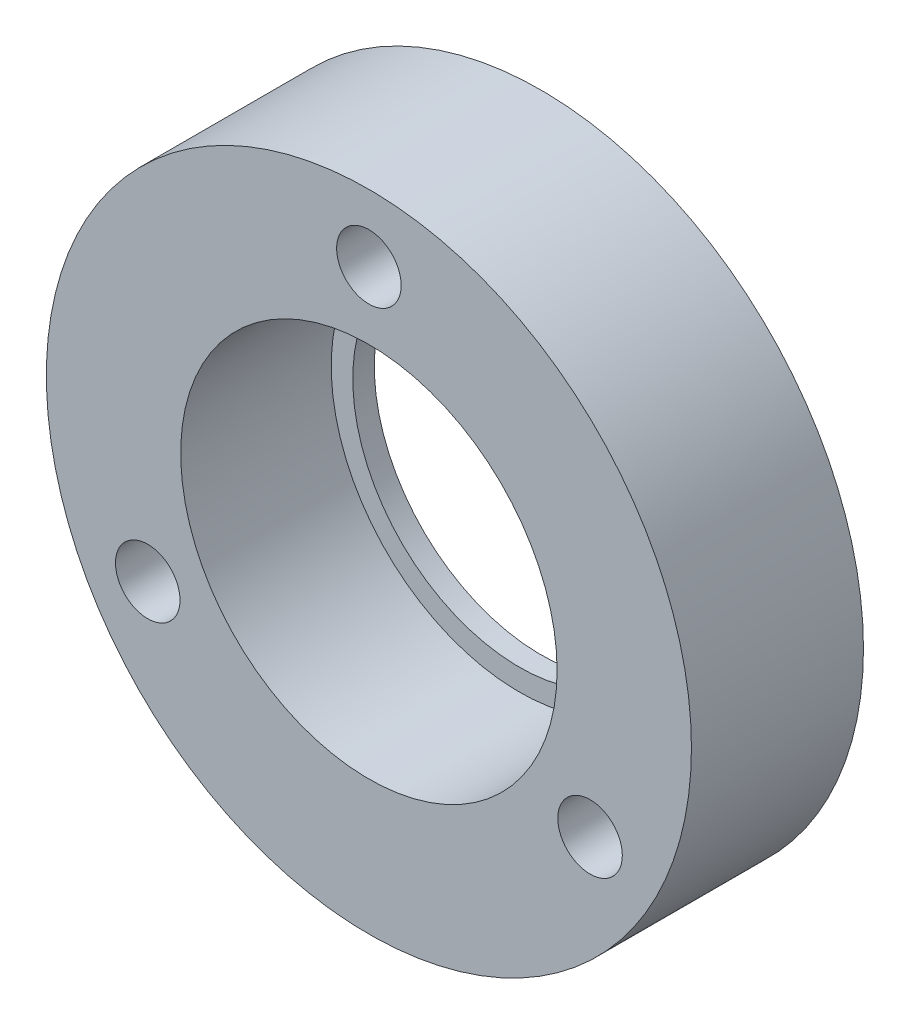
ISO-10303-21;
HEADER;
FILE_DESCRIPTION(('STEP AP214'),'2;1');
FILE_NAME('part.step','',(''),(''),'','','');
FILE_SCHEMA(('AUTOMOTIVE_DESIGN { 1 0 10303 214 1 1 1 1 }'));
ENDSEC;
DATA;
#1=APPLICATION_CONTEXT('core data for automotive mechanical design processes');
#2=APPLICATION_PROTOCOL_DEFINITION('international standard','automotive_design',2000,#1);
#3=PRODUCT_CONTEXT('',#1,'mechanical');
#4=PRODUCT('Part','Part','',(#3));
#5=PRODUCT_RELATED_PRODUCT_CATEGORY('part','',(#4));
#6=PRODUCT_DEFINITION_FORMATION('','',#4);
#7=PRODUCT_DEFINITION_CONTEXT('part definition',#1,'design');
#8=PRODUCT_DEFINITION('design','',#6,#7);
#9=PRODUCT_DEFINITION_SHAPE('','',#8);
#10=(LENGTH_UNIT() NAMED_UNIT(*) SI_UNIT(.MILLI.,.METRE.));
#11=(NAMED_UNIT(*) PLANE_ANGLE_UNIT() SI_UNIT($,.RADIAN.));
#12=(NAMED_UNIT(*) SI_UNIT($,.STERADIAN.) SOLID_ANGLE_UNIT());
#13=UNCERTAINTY_MEASURE_WITH_UNIT(LENGTH_MEASURE(1.E-05),#10,'distance_accuracy_value','');
#14=(GEOMETRIC_REPRESENTATION_CONTEXT(3) GLOBAL_UNCERTAINTY_ASSIGNED_CONTEXT((#13)) GLOBAL_UNIT_ASSIGNED_CONTEXT((#10,
#11,#12)) REPRESENTATION_CONTEXT('',''));
#15=CARTESIAN_POINT('',(0.,0.,0.));
#16=DIRECTION('',(0.,0.,1.));
#17=DIRECTION('',(1.,0.,0.));
#18=AXIS2_PLACEMENT_3D('',#15,#16,#17);
#19=CARTESIAN_POINT('',(0.,0.,16.));
#20=DIRECTION('',(0.,0.,-1.));
#21=DIRECTION('',(-1.,0.,0.));
#22=AXIS2_PLACEMENT_3D('',#19,#20,#21);
#23=CYLINDRICAL_SURFACE('',#22,30.);
#24=CARTESIAN_POINT('',(0.,0.,16.));
#25=DIRECTION('',(0.,0.,1.));
#26=DIRECTION('',(1.,0.,0.));
#27=AXIS2_PLACEMENT_3D('',#24,#25,#26);
#28=CIRCLE('',#27,30.);
#29=CARTESIAN_POINT('',(30.,0.,16.));
#30=VERTEX_POINT('',#29);
#31=EDGE_CURVE('E11',#30,#30,#28,.T.);
#32=ORIENTED_EDGE('',*,*,#31,.F.);
#33=EDGE_LOOP('',(#32));
#34=FACE_BOUND('',#33,.T.);
#35=CARTESIAN_POINT('',(0.,0.,0.));
#36=DIRECTION('',(0.,0.,1.));
#37=DIRECTION('',(1.,0.,0.));
#38=AXIS2_PLACEMENT_3D('',#35,#36,#37);
#39=CIRCLE('',#38,30.);
#40=CARTESIAN_POINT('',(30.,0.,0.));
#41=VERTEX_POINT('',#40);
#42=EDGE_CURVE('E43',#41,#41,#39,.T.);
#43=ORIENTED_EDGE('',*,*,#42,.T.);
#44=EDGE_LOOP('',(#43));
#45=FACE_BOUND('',#44,.T.);
#46=ADVANCED_FACE('F40',(#34,#45),#23,.T.);
#47=CARTESIAN_POINT('',(0.,0.,16.));
#48=DIRECTION('',(0.,0.,1.));
#49=DIRECTION('',(1.,0.,0.));
#50=AXIS2_PLACEMENT_3D('',#47,#48,#49);
#51=PLANE('',#50);
#52=CARTESIAN_POINT('',(20.5702684033898,-11.8762500000001,16.));
#53=DIRECTION('',(0.,0.,1.));
#54=DIRECTION('',(1.,0.,0.));
#55=AXIS2_PLACEMENT_3D('',#52,#53,#54);
#56=CIRCLE('',#55,3.);
#57=CARTESIAN_POINT('',(23.5702684033898,-11.8762500000001,16.));
#58=VERTEX_POINT('',#57);
#59=EDGE_CURVE('E86',#58,#58,#56,.T.);
#60=ORIENTED_EDGE('',*,*,#59,.F.);
#61=EDGE_LOOP('',(#60));
#62=FACE_BOUND('',#61,.T.);
#63=CARTESIAN_POINT('',(1.640322703572E-12,23.7524999999991,16.));
#64=DIRECTION('',(0.,0.,1.));
#65=DIRECTION('',(1.,0.,0.));
#66=AXIS2_PLACEMENT_3D('',#63,#64,#65);
#67=CIRCLE('',#66,2.99999999999869);
#68=CARTESIAN_POINT('',(3.00000000000033,23.7524999999991,16.));
#69=VERTEX_POINT('',#68);
#70=EDGE_CURVE('E67',#69,#69,#67,.T.);
#71=ORIENTED_EDGE('',*,*,#70,.F.);
#72=EDGE_LOOP('',(#71));
#73=FACE_BOUND('',#72,.T.);
#74=CARTESIAN_POINT('',(-20.5702684033884,-11.876249999999,16.));
#75=DIRECTION('',(0.,0.,1.));
#76=DIRECTION('',(1.,0.,0.));
#77=AXIS2_PLACEMENT_3D('',#74,#75,#76);
#78=CIRCLE('',#77,3.0000000000006);
#79=CARTESIAN_POINT('',(-17.5702684033878,-11.876249999999,16.));
#80=VERTEX_POINT('',#79);
#81=EDGE_CURVE('E77',#80,#80,#78,.T.);
#82=ORIENTED_EDGE('',*,*,#81,.F.);
#83=EDGE_LOOP('',(#82));
#84=FACE_BOUND('',#83,.T.);
#85=CARTESIAN_POINT('',(0.,0.,16.));
#86=DIRECTION('',(0.,0.,1.));
#87=DIRECTION('',(1.,0.,0.));
#88=AXIS2_PLACEMENT_3D('',#85,#86,#87);
#89=CIRCLE('',#88,17.505);
#90=CARTESIAN_POINT('',(17.505,0.,16.));
#91=VERTEX_POINT('',#90);
#92=EDGE_CURVE('E58',#91,#91,#89,.T.);
#93=ORIENTED_EDGE('',*,*,#92,.F.);
#94=EDGE_LOOP('',(#93));
#95=FACE_BOUND('',#94,.T.);
#96=ORIENTED_EDGE('',*,*,#31,.T.);
#97=EDGE_LOOP('',(#96));
#98=FACE_BOUND('',#97,.T.);
#99=ADVANCED_FACE('F111',(#62,#73,#84,#95,#98),#51,.T.);
#100=CARTESIAN_POINT('',(0.,0.,0.));
#101=DIRECTION('',(0.,0.,1.));
#102=DIRECTION('',(1.,0.,0.));
#103=AXIS2_PLACEMENT_3D('',#100,#101,#102);
#104=PLANE('',#103);
#105=CARTESIAN_POINT('',(20.5702684033898,-11.8762500000001,0.));
#106=DIRECTION('',(0.,0.,1.));
#107=DIRECTION('',(1.,0.,0.));
#108=AXIS2_PLACEMENT_3D('',#105,#106,#107);
#109=CIRCLE('',#108,3.);
#110=CARTESIAN_POINT('',(23.5702684033898,-11.8762500000001,0.));
#111=VERTEX_POINT('',#110);
#112=EDGE_CURVE('E91',#111,#111,#109,.T.);
#113=ORIENTED_EDGE('',*,*,#112,.T.);
#114=EDGE_LOOP('',(#113));
#115=FACE_BOUND('',#114,.T.);
#116=CARTESIAN_POINT('',(1.640322703572E-12,23.7524999999991,0.));
#117=DIRECTION('',(0.,0.,1.));
#118=DIRECTION('',(1.,0.,0.));
#119=AXIS2_PLACEMENT_3D('',#116,#117,#118);
#120=CIRCLE('',#119,2.99999999999869);
#121=CARTESIAN_POINT('',(3.00000000000033,23.7524999999991,0.));
#122=VERTEX_POINT('',#121);
#123=EDGE_CURVE('E72',#122,#122,#120,.T.);
#124=ORIENTED_EDGE('',*,*,#123,.T.);
#125=EDGE_LOOP('',(#124));
#126=FACE_BOUND('',#125,.T.);
#127=CARTESIAN_POINT('',(-20.5702684033884,-11.876249999999,0.));
#128=DIRECTION('',(0.,0.,1.));
#129=DIRECTION('',(1.,0.,0.));
#130=AXIS2_PLACEMENT_3D('',#127,#128,#129);
#131=CIRCLE('',#130,3.0000000000006);
#132=CARTESIAN_POINT('',(-17.5702684033878,-11.876249999999,0.));
#133=VERTEX_POINT('',#132);
#134=EDGE_CURVE('E73',#133,#133,#131,.T.);
#135=ORIENTED_EDGE('',*,*,#134,.T.);
#136=EDGE_LOOP('',(#135));
#137=FACE_BOUND('',#136,.T.);
#138=CARTESIAN_POINT('',(0.,0.,0.));
#139=DIRECTION('',(0.,0.,1.));
#140=DIRECTION('',(1.,0.,0.));
#141=AXIS2_PLACEMENT_3D('',#138,#139,#140);
#142=CIRCLE('',#141,15.5);
#143=CARTESIAN_POINT('',(15.5,0.,0.));
#144=VERTEX_POINT('',#143);
#145=EDGE_CURVE('E82',#144,#144,#142,.T.);
#146=ORIENTED_EDGE('',*,*,#145,.T.);
#147=EDGE_LOOP('',(#146));
#148=FACE_BOUND('',#147,.T.);
#149=ORIENTED_EDGE('',*,*,#42,.F.);
#150=EDGE_LOOP('',(#149));
#151=FACE_BOUND('',#150,.T.);
#152=ADVANCED_FACE('F113',(#115,#126,#137,#148,#151),#104,.F.);
#153=CARTESIAN_POINT('',(0.,0.,2.));
#154=DIRECTION('',(0.,0.,1.));
#155=DIRECTION('',(1.,0.,0.));
#156=AXIS2_PLACEMENT_3D('',#153,#154,#155);
#157=CYLINDRICAL_SURFACE('',#156,17.505);
#158=CARTESIAN_POINT('',(0.,0.,2.));
#159=DIRECTION('',(0.,0.,1.));
#160=DIRECTION('',(1.,0.,0.));
#161=AXIS2_PLACEMENT_3D('',#158,#159,#160);
#162=CIRCLE('',#161,17.505);
#163=CARTESIAN_POINT('',(17.505,0.,2.));
#164=VERTEX_POINT('',#163);
#165=EDGE_CURVE('E55',#164,#164,#162,.T.);
#166=ORIENTED_EDGE('',*,*,#165,.F.);
#167=EDGE_LOOP('',(#166));
#168=FACE_BOUND('',#167,.T.);
#169=ORIENTED_EDGE('',*,*,#92,.T.);
#170=EDGE_LOOP('',(#169));
#171=FACE_BOUND('',#170,.T.);
#172=ADVANCED_FACE('F109',(#168,#171),#157,.F.);
#173=CARTESIAN_POINT('',(0.,0.,2.));
#174=DIRECTION('',(0.,0.,1.));
#175=DIRECTION('',(1.,0.,0.));
#176=AXIS2_PLACEMENT_3D('',#173,#174,#175);
#177=PLANE('',#176);
#178=CARTESIAN_POINT('',(0.,0.,2.));
#179=DIRECTION('',(0.,0.,1.));
#180=DIRECTION('',(1.,0.,0.));
#181=AXIS2_PLACEMENT_3D('',#178,#179,#180);
#182=CIRCLE('',#181,15.5);
#183=CARTESIAN_POINT('',(15.5,0.,2.));
#184=VERTEX_POINT('',#183);
#185=EDGE_CURVE('E93',#184,#184,#182,.T.);
#186=ORIENTED_EDGE('',*,*,#185,.F.);
#187=EDGE_LOOP('',(#186));
#188=FACE_BOUND('',#187,.T.);
#189=ORIENTED_EDGE('',*,*,#165,.T.);
#190=EDGE_LOOP('',(#189));
#191=FACE_BOUND('',#190,.T.);
#192=ADVANCED_FACE('F126',(#188,#191),#177,.T.);
#193=CARTESIAN_POINT('',(0.,0.,0.));
#194=DIRECTION('',(0.,0.,1.));
#195=DIRECTION('',(1.,0.,0.));
#196=AXIS2_PLACEMENT_3D('',#193,#194,#195);
#197=CYLINDRICAL_SURFACE('',#196,15.5);
#198=ORIENTED_EDGE('',*,*,#145,.F.);
#199=EDGE_LOOP('',(#198));
#200=FACE_BOUND('',#199,.T.);
#201=ORIENTED_EDGE('',*,*,#185,.T.);
#202=EDGE_LOOP('',(#201));
#203=FACE_BOUND('',#202,.T.);
#204=ADVANCED_FACE('F130',(#200,#203),#197,.F.);
#205=CARTESIAN_POINT('',(-20.5702684033884,-11.876249999999,0.));
#206=DIRECTION('',(0.,0.,1.));
#207=DIRECTION('',(1.,0.,0.));
#208=AXIS2_PLACEMENT_3D('',#205,#206,#207);
#209=CYLINDRICAL_SURFACE('',#208,3.0000000000006);
#210=ORIENTED_EDGE('',*,*,#134,.F.);
#211=EDGE_LOOP('',(#210));
#212=FACE_BOUND('',#211,.T.);
#213=ORIENTED_EDGE('',*,*,#81,.T.);
#214=EDGE_LOOP('',(#213));
#215=FACE_BOUND('',#214,.T.);
#216=ADVANCED_FACE('F134',(#212,#215),#209,.F.);
#217=CARTESIAN_POINT('',(1.640322703572E-12,23.7524999999991,0.));
#218=DIRECTION('',(0.,0.,1.));
#219=DIRECTION('',(1.,0.,0.));
#220=AXIS2_PLACEMENT_3D('',#217,#218,#219);
#221=CYLINDRICAL_SURFACE('',#220,2.99999999999869);
#222=ORIENTED_EDGE('',*,*,#123,.F.);
#223=EDGE_LOOP('',(#222));
#224=FACE_BOUND('',#223,.T.);
#225=ORIENTED_EDGE('',*,*,#70,.T.);
#226=EDGE_LOOP('',(#225));
#227=FACE_BOUND('',#226,.T.);
#228=ADVANCED_FACE('F138',(#224,#227),#221,.F.);
#229=CARTESIAN_POINT('',(20.5702684033898,-11.8762500000001,0.));
#230=DIRECTION('',(0.,0.,1.));
#231=DIRECTION('',(1.,0.,0.));
#232=AXIS2_PLACEMENT_3D('',#229,#230,#231);
#233=CYLINDRICAL_SURFACE('',#232,3.);
#234=ORIENTED_EDGE('',*,*,#112,.F.);
#235=EDGE_LOOP('',(#234));
#236=FACE_BOUND('',#235,.T.);
#237=ORIENTED_EDGE('',*,*,#59,.T.);
#238=EDGE_LOOP('',(#237));
#239=FACE_BOUND('',#238,.T.);
#240=ADVANCED_FACE('F142',(#236,#239),#233,.F.);
#241=CLOSED_SHELL('',(#46,#99,#152,#172,#192,#204,#216,#228,#240));
#242=MANIFOLD_SOLID_BREP('B2',#241);
#243=ADVANCED_BREP_SHAPE_REPRESENTATION('',(#18,#242),#14);
#244=SHAPE_DEFINITION_REPRESENTATION(#9,#243);
ENDSEC;
END-ISO-10303-21;
